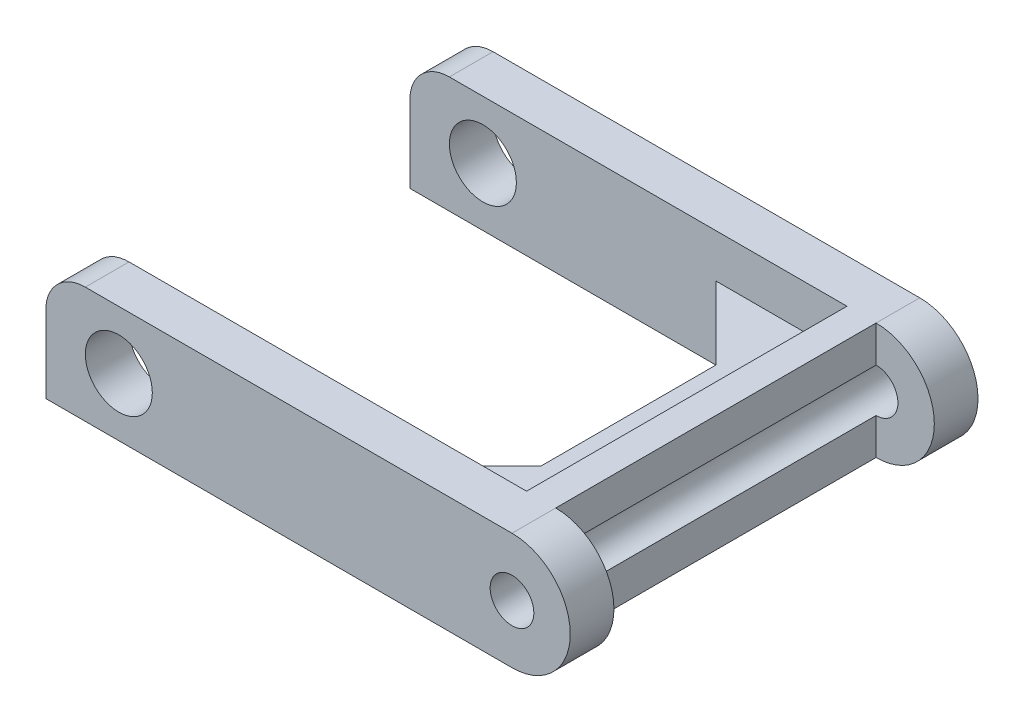
ISO-10303-21;
HEADER;
FILE_DESCRIPTION(('STEP AP214'),'2;1');
FILE_NAME('part.step','',(''),(''),'','','');
FILE_SCHEMA(('AUTOMOTIVE_DESIGN { 1 0 10303 214 1 1 1 1 }'));
ENDSEC;
DATA;
#1=APPLICATION_CONTEXT('core data for automotive mechanical design processes');
#2=APPLICATION_PROTOCOL_DEFINITION('international standard','automotive_design',2000,#1);
#3=PRODUCT_CONTEXT('',#1,'mechanical');
#4=PRODUCT('Part','Part','',(#3));
#5=PRODUCT_RELATED_PRODUCT_CATEGORY('part','',(#4));
#6=PRODUCT_DEFINITION_FORMATION('','',#4);
#7=PRODUCT_DEFINITION_CONTEXT('part definition',#1,'design');
#8=PRODUCT_DEFINITION('design','',#6,#7);
#9=PRODUCT_DEFINITION_SHAPE('','',#8);
#10=(LENGTH_UNIT() NAMED_UNIT(*) SI_UNIT(.MILLI.,.METRE.));
#11=(NAMED_UNIT(*) PLANE_ANGLE_UNIT() SI_UNIT($,.RADIAN.));
#12=(NAMED_UNIT(*) SI_UNIT($,.STERADIAN.) SOLID_ANGLE_UNIT());
#13=UNCERTAINTY_MEASURE_WITH_UNIT(LENGTH_MEASURE(1.E-05),#10,'distance_accuracy_value','');
#14=(GEOMETRIC_REPRESENTATION_CONTEXT(3) GLOBAL_UNCERTAINTY_ASSIGNED_CONTEXT((#13)) GLOBAL_UNIT_ASSIGNED_CONTEXT((#10,
#11,#12)) REPRESENTATION_CONTEXT('',''));
#15=CARTESIAN_POINT('',(0.,0.,0.));
#16=DIRECTION('',(0.,0.,1.));
#17=DIRECTION('',(1.,0.,0.));
#18=AXIS2_PLACEMENT_3D('',#15,#16,#17);
#19=CARTESIAN_POINT('',(-1.00000016391277,-19.4603503456678,-1.50000024586916));
#20=DIRECTION('',(-1.,0.,0.));
#21=DIRECTION('',(0.,0.,1.));
#22=AXIS2_PLACEMENT_3D('',#19,#20,#21);
#23=PLANE('',#22);
#24=DIRECTION('',(0.,1.,0.));
#25=VECTOR('',#24,1.);
#26=CARTESIAN_POINT('',(-1.00000016391277,-19.4603503456678,-12.5000001862645));
#27=LINE('',#26,#25);
#28=CARTESIAN_POINT('',(-1.00000016391277,0.500000071246183,-12.5000001862645));
#29=VERTEX_POINT('',#28);
#30=CARTESIAN_POINT('',(-1.00000016391277,1.99948681582866,-12.5000001862645));
#31=VERTEX_POINT('',#30);
#32=EDGE_CURVE('E298',#29,#31,#27,.T.);
#33=ORIENTED_EDGE('',*,*,#32,.F.);
#34=DIRECTION('',(0.,0.,-1.));
#35=VECTOR('',#34,1.);
#36=CARTESIAN_POINT('',(-1.00000016391277,0.500000071246183,-1.50000024586916));
#37=LINE('',#36,#35);
#38=CARTESIAN_POINT('',(-1.00000016391277,0.500000071246183,-1.50000024586916));
#39=VERTEX_POINT('',#38);
#40=EDGE_CURVE('E330',#39,#29,#37,.T.);
#41=ORIENTED_EDGE('',*,*,#40,.F.);
#42=DIRECTION('',(0.,1.,0.));
#43=VECTOR('',#42,1.);
#44=CARTESIAN_POINT('',(-1.00000016391277,-19.4603503456678,-1.50000024586916));
#45=LINE('',#44,#43);
#46=CARTESIAN_POINT('',(-1.00000016391277,1.99948681582866,-1.50000024586916));
#47=VERTEX_POINT('',#46);
#48=EDGE_CURVE('E294',#39,#47,#45,.T.);
#49=ORIENTED_EDGE('',*,*,#48,.T.);
#50=DIRECTION('',(0.,0.,1.));
#51=VECTOR('',#50,1.);
#52=CARTESIAN_POINT('',(-1.00000016391277,1.99948681582866,-14.0000004321337));
#53=LINE('',#52,#51);
#54=EDGE_CURVE('E235',#31,#47,#53,.T.);
#55=ORIENTED_EDGE('',*,*,#54,.F.);
#56=EDGE_LOOP('',(#33,#41,#49,#55));
#57=FACE_BOUND('',#56,.T.);
#58=ADVANCED_FACE('F43',(#57),#23,.T.);
#59=CARTESIAN_POINT('',(-14.6493035395222,0.635050337685843,-14.0000004321337));
#60=DIRECTION('',(0.,0.,1.));
#61=DIRECTION('',(1.,0.,0.));
#62=AXIS2_PLACEMENT_3D('',#59,#60,#61);
#63=CYLINDRICAL_SURFACE('',#62,1.35743104424977);
#64=DIRECTION('',(0.,0.,1.));
#65=VECTOR('',#64,1.);
#66=CARTESIAN_POINT('',(-15.9999998286366,0.770100604125558,-14.0000004321337));
#67=LINE('',#66,#65);
#68=CARTESIAN_POINT('',(-15.9999998286366,0.770100604125558,-14.0000004321337));
#69=VERTEX_POINT('',#68);
#70=CARTESIAN_POINT('',(-15.9999998286366,0.770100604125558,-12.5000001862645));
#71=VERTEX_POINT('',#70);
#72=EDGE_CURVE('E233',#69,#71,#67,.T.);
#73=ORIENTED_EDGE('',*,*,#72,.T.);
#74=CARTESIAN_POINT('',(-14.6493035395222,0.635050337685843,-12.5000001862645));
#75=DIRECTION('',(0.,0.,1.));
#76=DIRECTION('',(1.,0.,0.));
#77=AXIS2_PLACEMENT_3D('',#74,#75,#76);
#78=CIRCLE('',#77,1.35743104424977);
#79=CARTESIAN_POINT('',(-14.6500002160669,1.99248120315739,-12.5000001862645));
#80=VERTEX_POINT('',#79);
#81=EDGE_CURVE('E159',#71,#80,#78,.F.);
#82=ORIENTED_EDGE('',*,*,#81,.T.);
#83=DIRECTION('',(0.,0.,1.));
#84=VECTOR('',#83,1.);
#85=CARTESIAN_POINT('',(-14.6500002160669,1.99248120315739,-14.0000004321337));
#86=LINE('',#85,#84);
#87=CARTESIAN_POINT('',(-14.6500002160669,1.99248120315739,-14.0000004321337));
#88=VERTEX_POINT('',#87);
#89=EDGE_CURVE('E156',#88,#80,#86,.T.);
#90=ORIENTED_EDGE('',*,*,#89,.F.);
#91=CARTESIAN_POINT('',(-14.6493035395222,0.635050337685843,-14.0000004321337));
#92=DIRECTION('',(0.,0.,1.));
#93=DIRECTION('',(1.,0.,0.));
#94=AXIS2_PLACEMENT_3D('',#91,#92,#93);
#95=CIRCLE('',#94,1.35743104424977);
#96=EDGE_CURVE('E158',#88,#69,#95,.T.);
#97=ORIENTED_EDGE('',*,*,#96,.T.);
#98=EDGE_LOOP('',(#73,#82,#90,#97));
#99=FACE_BOUND('',#98,.T.);
#100=ADVANCED_FACE('F45',(#99),#63,.T.);
#101=CARTESIAN_POINT('',(-14.6493035395222,0.635050337685843,-1.50000024586917));
#102=DIRECTION('',(0.,0.,-1.));
#103=DIRECTION('',(-1.,0.,0.));
#104=AXIS2_PLACEMENT_3D('',#101,#102,#103);
#105=CIRCLE('',#104,1.35743104424977);
#106=CARTESIAN_POINT('',(-14.6500002160669,1.99248120315739,-1.50000024586917));
#107=VERTEX_POINT('',#106);
#108=CARTESIAN_POINT('',(-15.9999998286366,0.770100604125558,-1.50000024586917));
#109=VERTEX_POINT('',#108);
#110=EDGE_CURVE('E208',#107,#109,#105,.F.);
#111=ORIENTED_EDGE('',*,*,#110,.T.);
#112=DIRECTION('',(0.,0.,1.));
#113=VECTOR('',#112,1.);
#114=CARTESIAN_POINT('',(-15.9999998286366,0.770100604125558,-14.0000004321337));
#115=LINE('',#114,#113);
#116=CARTESIAN_POINT('',(-15.9999998286366,0.770100604125558,0.));
#117=VERTEX_POINT('',#116);
#118=EDGE_CURVE('E236',#109,#117,#115,.T.);
#119=ORIENTED_EDGE('',*,*,#118,.T.);
#120=CARTESIAN_POINT('',(-14.6493035395222,0.635050337685843,0.));
#121=DIRECTION('',(0.,0.,1.));
#122=DIRECTION('',(1.,0.,0.));
#123=AXIS2_PLACEMENT_3D('',#120,#121,#122);
#124=CIRCLE('',#123,1.35743104424977);
#125=CARTESIAN_POINT('',(-14.6500002160669,1.99248120315739,0.));
#126=VERTEX_POINT('',#125);
#127=EDGE_CURVE('E212',#126,#117,#124,.T.);
#128=ORIENTED_EDGE('',*,*,#127,.F.);
#129=EDGE_CURVE('E164',#107,#126,#86,.T.);
#130=ORIENTED_EDGE('',*,*,#129,.F.);
#131=EDGE_LOOP('',(#111,#119,#128,#130));
#132=FACE_BOUND('',#131,.T.);
#133=ADVANCED_FACE('F338',(#132),#63,.T.);
#134=CARTESIAN_POINT('',(-14.6500002160669,1.99248120315739,-14.0000004321337));
#135=DIRECTION('',(-0.000513231627973449,0.999999868296639,0.));
#136=DIRECTION('',(-0.999999868296639,-0.000513231627973449,0.));
#137=AXIS2_PLACEMENT_3D('',#134,#135,#136);
#138=PLANE('',#137);
#139=ORIENTED_EDGE('',*,*,#89,.T.);
#140=DIRECTION('',(0.999999868296639,0.000513231627973449,0.));
#141=VECTOR('',#140,1.);
#142=CARTESIAN_POINT('',(-14.6500002160669,1.99248120315739,-12.5000001862645));
#143=LINE('',#142,#141);
#144=EDGE_CURVE('E314',#80,#31,#143,.T.);
#145=ORIENTED_EDGE('',*,*,#144,.T.);
#146=ORIENTED_EDGE('',*,*,#54,.T.);
#147=DIRECTION('',(-0.999999868296639,-0.000513231627973449,0.));
#148=VECTOR('',#147,1.);
#149=CARTESIAN_POINT('',(-14.6500002160669,1.99248120315739,-1.50000024586917));
#150=LINE('',#149,#148);
#151=EDGE_CURVE('E307',#47,#107,#150,.T.);
#152=ORIENTED_EDGE('',*,*,#151,.T.);
#153=ORIENTED_EDGE('',*,*,#129,.T.);
#154=DIRECTION('',(-0.999999868296639,-0.000513231627973449,0.));
#155=VECTOR('',#154,1.);
#156=CARTESIAN_POINT('',(-14.6500002160669,1.99248120315739,0.));
#157=LINE('',#156,#155);
#158=CARTESIAN_POINT('',(-2.1606684497133E-07,2.00000004749746,0.));
#159=VERTEX_POINT('',#158);
#160=EDGE_CURVE('E170',#159,#126,#157,.T.);
#161=ORIENTED_EDGE('',*,*,#160,.F.);
#162=DIRECTION('',(0.,0.,1.));
#163=VECTOR('',#162,1.);
#164=CARTESIAN_POINT('',(-2.1606684497133E-07,2.00000004749746,-14.0000004321337));
#165=LINE('',#164,#163);
#166=CARTESIAN_POINT('',(0.,2.00000004749746,-1.50000024586916));
#167=VERTEX_POINT('',#166);
#168=EDGE_CURVE('E187',#167,#159,#165,.T.);
#169=ORIENTED_EDGE('',*,*,#168,.F.);
#170=DIRECTION('',(0.,0.,1.));
#171=VECTOR('',#170,1.);
#172=CARTESIAN_POINT('',(0.,2.00000004749746,-14.0000004321337));
#173=LINE('',#172,#171);
#174=CARTESIAN_POINT('',(0.,2.00000004749746,-12.5000001862645));
#175=VERTEX_POINT('',#174);
#176=EDGE_CURVE('E302',#167,#175,#173,.F.);
#177=ORIENTED_EDGE('',*,*,#176,.T.);
#178=CARTESIAN_POINT('',(-2.1606684497133E-07,2.00000004749746,-14.0000004321337));
#179=VERTEX_POINT('',#178);
#180=EDGE_CURVE('E176',#179,#175,#165,.T.);
#181=ORIENTED_EDGE('',*,*,#180,.F.);
#182=DIRECTION('',(-0.999999868296639,-0.000513231627973449,0.));
#183=VECTOR('',#182,1.);
#184=CARTESIAN_POINT('',(-14.6500002160669,1.99248120315739,-14.0000004321337));
#185=LINE('',#184,#183);
#186=EDGE_CURVE('E169',#179,#88,#185,.T.);
#187=ORIENTED_EDGE('',*,*,#186,.T.);
#188=EDGE_LOOP('',(#139,#145,#146,#152,#153,#161,#169,#177,#181,#187));
#189=FACE_BOUND('',#188,.T.);
#190=ADVANCED_FACE('F173',(#189),#138,.T.);
#191=CARTESIAN_POINT('',(0.,0.,-14.0000004321337));
#192=DIRECTION('',(0.,0.,1.));
#193=DIRECTION('',(1.,0.,0.));
#194=AXIS2_PLACEMENT_3D('',#191,#192,#193);
#195=CYLINDRICAL_SURFACE('',#194,2.00000004749746);
#196=CARTESIAN_POINT('',(0.,0.,-14.0000004321337));
#197=DIRECTION('',(0.,0.,1.));
#198=DIRECTION('',(1.,0.,0.));
#199=AXIS2_PLACEMENT_3D('',#196,#197,#198);
#200=CIRCLE('',#199,2.00000004749746);
#201=CARTESIAN_POINT('',(0.,-2.00000004749746,-14.0000004321337));
#202=VERTEX_POINT('',#201);
#203=EDGE_CURVE('E178',#202,#179,#200,.T.);
#204=ORIENTED_EDGE('',*,*,#203,.T.);
#205=ORIENTED_EDGE('',*,*,#180,.T.);
#206=CARTESIAN_POINT('',(0.,0.,-12.5000001862645));
#207=DIRECTION('',(0.,0.,1.));
#208=DIRECTION('',(1.,0.,0.));
#209=AXIS2_PLACEMENT_3D('',#206,#207,#208);
#210=CIRCLE('',#209,2.00000004749746);
#211=CARTESIAN_POINT('',(0.,-2.00000004749745,-12.5000001862645));
#212=VERTEX_POINT('',#211);
#213=EDGE_CURVE('E98',#175,#212,#210,.F.);
#214=ORIENTED_EDGE('',*,*,#213,.T.);
#215=DIRECTION('',(0.,0.,1.));
#216=VECTOR('',#215,1.);
#217=CARTESIAN_POINT('',(0.,-2.00000004749746,-14.0000004321337));
#218=LINE('',#217,#216);
#219=EDGE_CURVE('E188',#202,#212,#218,.T.);
#220=ORIENTED_EDGE('',*,*,#219,.F.);
#221=EDGE_LOOP('',(#204,#205,#214,#220));
#222=FACE_BOUND('',#221,.T.);
#223=ADVANCED_FACE('F358',(#222),#195,.T.);
#224=ORIENTED_EDGE('',*,*,#168,.T.);
#225=CARTESIAN_POINT('',(0.,0.,0.));
#226=DIRECTION('',(0.,0.,1.));
#227=DIRECTION('',(1.,0.,0.));
#228=AXIS2_PLACEMENT_3D('',#225,#226,#227);
#229=CIRCLE('',#228,2.00000004749746);
#230=CARTESIAN_POINT('',(0.,-2.00000004749746,0.));
#231=VERTEX_POINT('',#230);
#232=EDGE_CURVE('E216',#231,#159,#229,.T.);
#233=ORIENTED_EDGE('',*,*,#232,.F.);
#234=CARTESIAN_POINT('',(0.,-2.00000004749746,-1.50000024586916));
#235=VERTEX_POINT('',#234);
#236=EDGE_CURVE('E190',#235,#231,#218,.T.);
#237=ORIENTED_EDGE('',*,*,#236,.F.);
#238=CARTESIAN_POINT('',(0.,0.,-1.50000024586916));
#239=DIRECTION('',(0.,0.,-1.));
#240=DIRECTION('',(-1.,0.,0.));
#241=AXIS2_PLACEMENT_3D('',#238,#239,#240);
#242=CIRCLE('',#241,2.00000004749746);
#243=EDGE_CURVE('E282',#235,#167,#242,.F.);
#244=ORIENTED_EDGE('',*,*,#243,.T.);
#245=EDGE_LOOP('',(#224,#233,#237,#244));
#246=FACE_BOUND('',#245,.T.);
#247=ADVANCED_FACE('F347',(#246),#195,.T.);
#248=CARTESIAN_POINT('',(-15.9999998286366,-2.00000004749745,-14.0000004321337));
#249=DIRECTION('',(0.,-1.,0.));
#250=DIRECTION('',(0.,0.,-1.));
#251=AXIS2_PLACEMENT_3D('',#248,#249,#250);
#252=PLANE('',#251);
#253=DIRECTION('',(0.,0.,-1.));
#254=VECTOR('',#253,1.);
#255=CARTESIAN_POINT('',(-1.00000016391277,-2.00000004749745,-14.0000004321337));
#256=LINE('',#255,#254);
#257=CARTESIAN_POINT('',(-1.00000016391277,-2.00000004749745,-1.50000024586916));
#258=VERTEX_POINT('',#257);
#259=CARTESIAN_POINT('',(-1.00000016391277,-2.00000004749745,-12.5000001862645));
#260=VERTEX_POINT('',#259);
#261=EDGE_CURVE('E12',#258,#260,#256,.T.);
#262=ORIENTED_EDGE('',*,*,#261,.T.);
#263=DIRECTION('',(-1.,0.,0.));
#264=VECTOR('',#263,1.);
#265=CARTESIAN_POINT('',(-15.9999998286366,-2.00000004749745,-12.5000001862645));
#266=LINE('',#265,#264);
#267=CARTESIAN_POINT('',(-15.9999998286366,-2.00000004749745,-12.5000001862645));
#268=VERTEX_POINT('',#267);
#269=EDGE_CURVE('E207',#260,#268,#266,.T.);
#270=ORIENTED_EDGE('',*,*,#269,.T.);
#271=DIRECTION('',(0.,0.,1.));
#272=VECTOR('',#271,1.);
#273=CARTESIAN_POINT('',(-15.9999998286366,-2.00000004749745,-14.0000004321337));
#274=LINE('',#273,#272);
#275=CARTESIAN_POINT('',(-15.9999998286366,-2.00000004749745,-14.0000004321337));
#276=VERTEX_POINT('',#275);
#277=EDGE_CURVE('E180',#276,#268,#274,.T.);
#278=ORIENTED_EDGE('',*,*,#277,.F.);
#279=DIRECTION('',(1.,0.,0.));
#280=VECTOR('',#279,1.);
#281=CARTESIAN_POINT('',(-15.9999998286366,-2.00000004749745,-14.0000004321337));
#282=LINE('',#281,#280);
#283=EDGE_CURVE('E182',#276,#202,#282,.T.);
#284=ORIENTED_EDGE('',*,*,#283,.T.);
#285=ORIENTED_EDGE('',*,*,#219,.T.);
#286=DIRECTION('',(0.,0.,1.));
#287=VECTOR('',#286,1.);
#288=CARTESIAN_POINT('',(0.,-2.00000004749745,-14.0000004321337));
#289=LINE('',#288,#287);
#290=EDGE_CURVE('E280',#212,#235,#289,.T.);
#291=ORIENTED_EDGE('',*,*,#290,.T.);
#292=ORIENTED_EDGE('',*,*,#236,.T.);
#293=DIRECTION('',(1.,0.,0.));
#294=VECTOR('',#293,1.);
#295=CARTESIAN_POINT('',(-15.9999998286366,-2.00000004749745,0.));
#296=LINE('',#295,#294);
#297=CARTESIAN_POINT('',(-15.9999998286366,-2.00000004749745,0.));
#298=VERTEX_POINT('',#297);
#299=EDGE_CURVE('E211',#298,#231,#296,.T.);
#300=ORIENTED_EDGE('',*,*,#299,.F.);
#301=CARTESIAN_POINT('',(-15.9999998286366,-2.00000004749745,-1.50000024586917));
#302=VERTEX_POINT('',#301);
#303=EDGE_CURVE('E177',#302,#298,#274,.T.);
#304=ORIENTED_EDGE('',*,*,#303,.F.);
#305=DIRECTION('',(1.,0.,0.));
#306=VECTOR('',#305,1.);
#307=CARTESIAN_POINT('',(-15.9999998286367,-2.00000004749745,-1.50000024586917));
#308=LINE('',#307,#306);
#309=EDGE_CURVE('E204',#302,#258,#308,.T.);
#310=ORIENTED_EDGE('',*,*,#309,.T.);
#311=EDGE_LOOP('',(#262,#270,#278,#284,#285,#291,#292,#300,#304,#310));
#312=FACE_BOUND('',#311,.T.);
#313=ADVANCED_FACE('F359',(#312),#252,.T.);
#314=CARTESIAN_POINT('',(-15.9999998286366,0.500000071246183,-14.0000004321337));
#315=DIRECTION('',(-1.,0.,0.));
#316=DIRECTION('',(0.,0.,1.));
#317=AXIS2_PLACEMENT_3D('',#314,#315,#316);
#318=PLANE('',#317);
#319=ORIENTED_EDGE('',*,*,#277,.T.);
#320=DIRECTION('',(0.,1.,0.));
#321=VECTOR('',#320,1.);
#322=CARTESIAN_POINT('',(-15.9999998286366,-19.4603503456678,-12.5000001862645));
#323=LINE('',#322,#321);
#324=EDGE_CURVE('E234',#268,#71,#323,.T.);
#325=ORIENTED_EDGE('',*,*,#324,.T.);
#326=ORIENTED_EDGE('',*,*,#72,.F.);
#327=DIRECTION('',(0.,-1.,0.));
#328=VECTOR('',#327,1.);
#329=CARTESIAN_POINT('',(-15.9999998286366,0.500000071246183,-14.0000004321337));
#330=LINE('',#329,#328);
#331=EDGE_CURVE('E47',#69,#276,#330,.T.);
#332=ORIENTED_EDGE('',*,*,#331,.T.);
#333=EDGE_LOOP('',(#319,#325,#326,#332));
#334=FACE_BOUND('',#333,.T.);
#335=ADVANCED_FACE('F231',(#334),#318,.T.);
#336=DIRECTION('',(0.,-1.,0.));
#337=VECTOR('',#336,1.);
#338=CARTESIAN_POINT('',(-15.9999998286366,0.500000071246183,0.));
#339=LINE('',#338,#337);
#340=EDGE_CURVE('E209',#117,#298,#339,.T.);
#341=ORIENTED_EDGE('',*,*,#340,.F.);
#342=ORIENTED_EDGE('',*,*,#118,.F.);
#343=DIRECTION('',(0.,1.,0.));
#344=VECTOR('',#343,1.);
#345=CARTESIAN_POINT('',(-15.9999998286366,-19.4603503456678,-1.50000024586917));
#346=LINE('',#345,#344);
#347=EDGE_CURVE('E289',#302,#109,#346,.T.);
#348=ORIENTED_EDGE('',*,*,#347,.F.);
#349=ORIENTED_EDGE('',*,*,#303,.T.);
#350=EDGE_LOOP('',(#341,#342,#348,#349));
#351=FACE_BOUND('',#350,.T.);
#352=ADVANCED_FACE('F364',(#351),#318,.T.);
#353=CARTESIAN_POINT('',(-14.6493035395222,0.635050337685843,-14.0000004321337));
#354=DIRECTION('',(0.,0.,1.));
#355=DIRECTION('',(1.,0.,0.));
#356=AXIS2_PLACEMENT_3D('',#353,#354,#355);
#357=PLANE('',#356);
#358=CARTESIAN_POINT('',(-13.5000002160668,4.74974573561049E-08,-14.0000004321337));
#359=DIRECTION('',(0.,0.,1.));
#360=DIRECTION('',(1.,0.,0.));
#361=AXIS2_PLACEMENT_3D('',#358,#359,#360);
#362=CIRCLE('',#361,1.15);
#363=CARTESIAN_POINT('',(-12.3500002160668,4.74974573561049E-08,-14.0000004321337));
#364=VERTEX_POINT('',#363);
#365=EDGE_CURVE('E218',#364,#364,#362,.T.);
#366=ORIENTED_EDGE('',*,*,#365,.T.);
#367=EDGE_LOOP('',(#366));
#368=FACE_BOUND('',#367,.T.);
#369=CARTESIAN_POINT('',(0.,0.,-14.0000004321337));
#370=DIRECTION('',(0.,0.,1.));
#371=DIRECTION('',(1.,0.,0.));
#372=AXIS2_PLACEMENT_3D('',#369,#370,#371);
#373=CIRCLE('',#372,0.749999783933157);
#374=CARTESIAN_POINT('',(0.749999783933157,0.,-14.0000004321337));
#375=VERTEX_POINT('',#374);
#376=EDGE_CURVE('E247',#375,#375,#373,.T.);
#377=ORIENTED_EDGE('',*,*,#376,.T.);
#378=EDGE_LOOP('',(#377));
#379=FACE_BOUND('',#378,.T.);
#380=ORIENTED_EDGE('',*,*,#331,.F.);
#381=ORIENTED_EDGE('',*,*,#96,.F.);
#382=ORIENTED_EDGE('',*,*,#186,.F.);
#383=ORIENTED_EDGE('',*,*,#203,.F.);
#384=ORIENTED_EDGE('',*,*,#283,.F.);
#385=EDGE_LOOP('',(#380,#381,#382,#383,#384));
#386=FACE_BOUND('',#385,.T.);
#387=ADVANCED_FACE('F167',(#368,#379,#386),#357,.F.);
#388=CARTESIAN_POINT('',(-14.6493035395222,0.635050337685843,0.));
#389=DIRECTION('',(0.,0.,1.));
#390=DIRECTION('',(1.,0.,0.));
#391=AXIS2_PLACEMENT_3D('',#388,#389,#390);
#392=PLANE('',#391);
#393=CARTESIAN_POINT('',(-13.5000002160668,4.74974573561049E-08,0.));
#394=DIRECTION('',(0.,0.,1.));
#395=DIRECTION('',(1.,0.,0.));
#396=AXIS2_PLACEMENT_3D('',#393,#394,#395);
#397=CIRCLE('',#396,1.15);
#398=CARTESIAN_POINT('',(-12.3500002160668,4.74974573561049E-08,0.));
#399=VERTEX_POINT('',#398);
#400=EDGE_CURVE('E223',#399,#399,#397,.T.);
#401=ORIENTED_EDGE('',*,*,#400,.F.);
#402=EDGE_LOOP('',(#401));
#403=FACE_BOUND('',#402,.T.);
#404=CARTESIAN_POINT('',(0.,0.,0.));
#405=DIRECTION('',(0.,0.,1.));
#406=DIRECTION('',(1.,0.,0.));
#407=AXIS2_PLACEMENT_3D('',#404,#405,#406);
#408=CIRCLE('',#407,0.749999783933157);
#409=CARTESIAN_POINT('',(0.749999783933157,0.,0.));
#410=VERTEX_POINT('',#409);
#411=EDGE_CURVE('E239',#410,#410,#408,.T.);
#412=ORIENTED_EDGE('',*,*,#411,.F.);
#413=EDGE_LOOP('',(#412));
#414=FACE_BOUND('',#413,.T.);
#415=ORIENTED_EDGE('',*,*,#127,.T.);
#416=ORIENTED_EDGE('',*,*,#340,.T.);
#417=ORIENTED_EDGE('',*,*,#299,.T.);
#418=ORIENTED_EDGE('',*,*,#232,.T.);
#419=ORIENTED_EDGE('',*,*,#160,.T.);
#420=EDGE_LOOP('',(#415,#416,#417,#418,#419));
#421=FACE_BOUND('',#420,.T.);
#422=ADVANCED_FACE('F255',(#403,#414,#421),#392,.T.);
#423=CARTESIAN_POINT('',(-13.5000002160668,4.74974573561049E-08,-14.0000004321337));
#424=DIRECTION('',(0.,0.,1.));
#425=DIRECTION('',(1.,0.,0.));
#426=AXIS2_PLACEMENT_3D('',#423,#424,#425);
#427=CYLINDRICAL_SURFACE('',#426,1.15);
#428=ORIENTED_EDGE('',*,*,#365,.F.);
#429=EDGE_LOOP('',(#428));
#430=FACE_BOUND('',#429,.T.);
#431=CARTESIAN_POINT('',(-13.5000002160668,4.74974573561049E-08,-12.5000001862645));
#432=DIRECTION('',(0.,0.,1.));
#433=DIRECTION('',(1.,0.,0.));
#434=AXIS2_PLACEMENT_3D('',#431,#432,#433);
#435=CIRCLE('',#434,1.15);
#436=CARTESIAN_POINT('',(-12.3500002160668,4.74974573561049E-08,-12.5000001862645));
#437=VERTEX_POINT('',#436);
#438=EDGE_CURVE('E205',#437,#437,#435,.F.);
#439=ORIENTED_EDGE('',*,*,#438,.F.);
#440=EDGE_LOOP('',(#439));
#441=FACE_BOUND('',#440,.T.);
#442=ADVANCED_FACE('F258',(#430,#441),#427,.F.);
#443=ORIENTED_EDGE('',*,*,#400,.T.);
#444=EDGE_LOOP('',(#443));
#445=FACE_BOUND('',#444,.T.);
#446=CARTESIAN_POINT('',(-13.5000002160668,4.74974573561049E-08,-1.50000024586917));
#447=DIRECTION('',(0.,0.,-1.));
#448=DIRECTION('',(-1.,0.,0.));
#449=AXIS2_PLACEMENT_3D('',#446,#447,#448);
#450=CIRCLE('',#449,1.15);
#451=CARTESIAN_POINT('',(-14.6500002160668,4.74974573561049E-08,-1.50000024586917));
#452=VERTEX_POINT('',#451);
#453=EDGE_CURVE('E201',#452,#452,#450,.F.);
#454=ORIENTED_EDGE('',*,*,#453,.F.);
#455=EDGE_LOOP('',(#454));
#456=FACE_BOUND('',#455,.T.);
#457=ADVANCED_FACE('F252',(#445,#456),#427,.F.);
#458=CARTESIAN_POINT('',(0.,0.,-14.0000004321337));
#459=DIRECTION('',(0.,0.,1.));
#460=DIRECTION('',(1.,0.,0.));
#461=AXIS2_PLACEMENT_3D('',#458,#459,#460);
#462=CYLINDRICAL_SURFACE('',#461,0.749999783933157);
#463=ORIENTED_EDGE('',*,*,#411,.T.);
#464=EDGE_LOOP('',(#463));
#465=FACE_BOUND('',#464,.T.);
#466=ORIENTED_EDGE('',*,*,#376,.F.);
#467=EDGE_LOOP('',(#466));
#468=FACE_BOUND('',#467,.T.);
#469=CARTESIAN_POINT('',(0.,0.,-12.5000001862645));
#470=DIRECTION('',(0.,0.,1.));
#471=DIRECTION('',(1.,0.,0.));
#472=AXIS2_PLACEMENT_3D('',#469,#470,#471);
#473=CIRCLE('',#472,0.749999783933157);
#474=CARTESIAN_POINT('',(0.,0.749999783933156,-12.5000001862645));
#475=VERTEX_POINT('',#474);
#476=CARTESIAN_POINT('',(0.,-0.749999783933156,-12.5000001862645));
#477=VERTEX_POINT('',#476);
#478=EDGE_CURVE('E52',#475,#477,#473,.F.);
#479=ORIENTED_EDGE('',*,*,#478,.F.);
#480=DIRECTION('',(0.,0.,1.));
#481=VECTOR('',#480,1.);
#482=CARTESIAN_POINT('',(0.,0.749999783933157,-14.0000004321337));
#483=LINE('',#482,#481);
#484=CARTESIAN_POINT('',(0.,0.749999783933157,-1.50000024586916));
#485=VERTEX_POINT('',#484);
#486=EDGE_CURVE('E197',#485,#475,#483,.F.);
#487=ORIENTED_EDGE('',*,*,#486,.F.);
#488=CARTESIAN_POINT('',(0.,0.,-1.50000024586916));
#489=DIRECTION('',(0.,0.,-1.));
#490=DIRECTION('',(-1.,0.,0.));
#491=AXIS2_PLACEMENT_3D('',#488,#489,#490);
#492=CIRCLE('',#491,0.749999783933157);
#493=CARTESIAN_POINT('',(0.,-0.749999783933157,-1.50000024586916));
#494=VERTEX_POINT('',#493);
#495=EDGE_CURVE('E163',#494,#485,#492,.F.);
#496=ORIENTED_EDGE('',*,*,#495,.F.);
#497=DIRECTION('',(0.,0.,1.));
#498=VECTOR('',#497,1.);
#499=CARTESIAN_POINT('',(0.,-0.749999783933157,-14.0000004321337));
#500=LINE('',#499,#498);
#501=EDGE_CURVE('E195',#477,#494,#500,.T.);
#502=ORIENTED_EDGE('',*,*,#501,.F.);
#503=EDGE_LOOP('',(#479,#487,#496,#502));
#504=FACE_BOUND('',#503,.T.);
#505=ADVANCED_FACE('F262',(#465,#468,#504),#462,.F.);
#506=CARTESIAN_POINT('',(0.,-19.4603503456678,-1.50000024586916));
#507=DIRECTION('',(0.,0.,-1.));
#508=DIRECTION('',(-1.,0.,0.));
#509=AXIS2_PLACEMENT_3D('',#506,#507,#508);
#510=PLANE('',#509);
#511=DIRECTION('',(0.,1.,0.));
#512=VECTOR('',#511,1.);
#513=CARTESIAN_POINT('',(0.,-19.4603503456678,-1.50000024586916));
#514=LINE('',#513,#512);
#515=EDGE_CURVE('E69',#235,#494,#514,.T.);
#516=ORIENTED_EDGE('',*,*,#515,.T.);
#517=ORIENTED_EDGE('',*,*,#495,.T.);
#518=EDGE_CURVE('E286',#485,#167,#514,.T.);
#519=ORIENTED_EDGE('',*,*,#518,.T.);
#520=ORIENTED_EDGE('',*,*,#243,.F.);
#521=EDGE_LOOP('',(#516,#517,#519,#520));
#522=FACE_BOUND('',#521,.T.);
#523=ADVANCED_FACE('F265',(#522),#510,.T.);
#524=CARTESIAN_POINT('',(0.,-19.4603503456678,-12.5000001862645));
#525=DIRECTION('',(1.,0.,0.));
#526=DIRECTION('',(0.,0.,-1.));
#527=AXIS2_PLACEMENT_3D('',#524,#525,#526);
#528=PLANE('',#527);
#529=DIRECTION('',(0.,1.,0.));
#530=VECTOR('',#529,1.);
#531=CARTESIAN_POINT('',(0.,-19.4603503456678,-12.5000001862645));
#532=LINE('',#531,#530);
#533=EDGE_CURVE('E276',#212,#477,#532,.T.);
#534=ORIENTED_EDGE('',*,*,#533,.T.);
#535=ORIENTED_EDGE('',*,*,#501,.T.);
#536=ORIENTED_EDGE('',*,*,#515,.F.);
#537=ORIENTED_EDGE('',*,*,#290,.F.);
#538=EDGE_LOOP('',(#534,#535,#536,#537));
#539=FACE_BOUND('',#538,.T.);
#540=ADVANCED_FACE('F278',(#539),#528,.T.);
#541=ORIENTED_EDGE('',*,*,#518,.F.);
#542=ORIENTED_EDGE('',*,*,#486,.T.);
#543=EDGE_CURVE('E277',#475,#175,#532,.T.);
#544=ORIENTED_EDGE('',*,*,#543,.T.);
#545=ORIENTED_EDGE('',*,*,#176,.F.);
#546=EDGE_LOOP('',(#541,#542,#544,#545));
#547=FACE_BOUND('',#546,.T.);
#548=ADVANCED_FACE('F352',(#547),#528,.T.);
#549=CARTESIAN_POINT('',(1.99999939650297,-19.4603503456678,-12.5000001862645));
#550=DIRECTION('',(0.,0.,1.));
#551=DIRECTION('',(1.,0.,0.));
#552=AXIS2_PLACEMENT_3D('',#549,#550,#551);
#553=PLANE('',#552);
#554=ORIENTED_EDGE('',*,*,#213,.F.);
#555=ORIENTED_EDGE('',*,*,#543,.F.);
#556=ORIENTED_EDGE('',*,*,#478,.T.);
#557=ORIENTED_EDGE('',*,*,#533,.F.);
#558=EDGE_LOOP('',(#554,#555,#556,#557));
#559=FACE_BOUND('',#558,.T.);
#560=ADVANCED_FACE('F274',(#559),#553,.T.);
#561=CARTESIAN_POINT('',(-5.50000020302832,-19.4603503456678,-12.5000001862645));
#562=DIRECTION('',(0.,0.,1.));
#563=DIRECTION('',(1.,0.,0.));
#564=AXIS2_PLACEMENT_3D('',#561,#562,#563);
#565=PLANE('',#564);
#566=DIRECTION('',(-1.,0.,0.));
#567=VECTOR('',#566,1.);
#568=CARTESIAN_POINT('',(-1.00000016391277,-0.499999976251268,-12.5000001862645));
#569=LINE('',#568,#567);
#570=CARTESIAN_POINT('',(-1.00000016391277,-0.499999976251268,-12.5000001862645));
#571=VERTEX_POINT('',#570);
#572=CARTESIAN_POINT('',(-5.50000020302832,-0.499999976251268,-12.5000001862645));
#573=VERTEX_POINT('',#572);
#574=EDGE_CURVE('E416',#571,#573,#569,.T.);
#575=ORIENTED_EDGE('',*,*,#574,.T.);
#576=DIRECTION('',(0.,1.,0.));
#577=VECTOR('',#576,1.);
#578=CARTESIAN_POINT('',(-5.50000020302832,-0.499999976251268,-12.5000001862645));
#579=LINE('',#578,#577);
#580=CARTESIAN_POINT('',(-5.50000020302832,0.500000071246183,-12.5000001862645));
#581=VERTEX_POINT('',#580);
#582=EDGE_CURVE('E407',#573,#581,#579,.T.);
#583=ORIENTED_EDGE('',*,*,#582,.T.);
#584=DIRECTION('',(-1.,0.,0.));
#585=VECTOR('',#584,1.);
#586=CARTESIAN_POINT('',(-1.00000016391277,0.500000071246183,-12.5000001862645));
#587=LINE('',#586,#585);
#588=EDGE_CURVE('E325',#29,#581,#587,.T.);
#589=ORIENTED_EDGE('',*,*,#588,.F.);
#590=ORIENTED_EDGE('',*,*,#32,.T.);
#591=ORIENTED_EDGE('',*,*,#144,.F.);
#592=ORIENTED_EDGE('',*,*,#81,.F.);
#593=ORIENTED_EDGE('',*,*,#324,.F.);
#594=ORIENTED_EDGE('',*,*,#269,.F.);
#595=EDGE_CURVE('E295',#260,#571,#27,.T.);
#596=ORIENTED_EDGE('',*,*,#595,.T.);
#597=EDGE_LOOP('',(#575,#583,#589,#590,#591,#592,#593,#594,#596));
#598=FACE_BOUND('',#597,.T.);
#599=ORIENTED_EDGE('',*,*,#438,.T.);
#600=EDGE_LOOP('',(#599));
#601=FACE_BOUND('',#600,.T.);
#602=ADVANCED_FACE('F318',(#598,#601),#565,.T.);
#603=CARTESIAN_POINT('',(-15.9999998286366,-19.4603503456678,-1.50000024586917));
#604=DIRECTION('',(0.,0.,-1.));
#605=DIRECTION('',(-1.,0.,0.));
#606=AXIS2_PLACEMENT_3D('',#603,#604,#605);
#607=PLANE('',#606);
#608=DIRECTION('',(1.,0.,0.));
#609=VECTOR('',#608,1.);
#610=CARTESIAN_POINT('',(-5.50000020302832,-0.499999976251268,-1.50000024586916));
#611=LINE('',#610,#609);
#612=CARTESIAN_POINT('',(-5.50000020302832,-0.499999976251268,-1.50000024586916));
#613=VERTEX_POINT('',#612);
#614=CARTESIAN_POINT('',(-1.00000016391277,-0.499999976251268,-1.50000024586916));
#615=VERTEX_POINT('',#614);
#616=EDGE_CURVE('E369',#613,#615,#611,.T.);
#617=ORIENTED_EDGE('',*,*,#616,.T.);
#618=EDGE_CURVE('E291',#258,#615,#45,.T.);
#619=ORIENTED_EDGE('',*,*,#618,.F.);
#620=ORIENTED_EDGE('',*,*,#309,.F.);
#621=ORIENTED_EDGE('',*,*,#347,.T.);
#622=ORIENTED_EDGE('',*,*,#110,.F.);
#623=ORIENTED_EDGE('',*,*,#151,.F.);
#624=ORIENTED_EDGE('',*,*,#48,.F.);
#625=DIRECTION('',(1.,0.,0.));
#626=VECTOR('',#625,1.);
#627=CARTESIAN_POINT('',(-5.50000020302832,0.500000071246183,-1.50000024586916));
#628=LINE('',#627,#626);
#629=CARTESIAN_POINT('',(-5.50000020302832,0.500000071246183,-1.50000024586916));
#630=VERTEX_POINT('',#629);
#631=EDGE_CURVE('E60',#630,#39,#628,.T.);
#632=ORIENTED_EDGE('',*,*,#631,.F.);
#633=DIRECTION('',(0.,1.,0.));
#634=VECTOR('',#633,1.);
#635=CARTESIAN_POINT('',(-5.50000020302832,-0.499999976251268,-1.50000024586916));
#636=LINE('',#635,#634);
#637=EDGE_CURVE('E327',#613,#630,#636,.T.);
#638=ORIENTED_EDGE('',*,*,#637,.F.);
#639=EDGE_LOOP('',(#617,#619,#620,#621,#622,#623,#624,#632,#638));
#640=FACE_BOUND('',#639,.T.);
#641=ORIENTED_EDGE('',*,*,#453,.T.);
#642=EDGE_LOOP('',(#641));
#643=FACE_BOUND('',#642,.T.);
#644=ADVANCED_FACE('F333',(#640,#643),#607,.T.);
#645=DIRECTION('',(0.,0.,-1.));
#646=VECTOR('',#645,1.);
#647=CARTESIAN_POINT('',(-1.00000016391277,-0.499999976251268,-1.50000024586916));
#648=LINE('',#647,#646);
#649=EDGE_CURVE('E375',#615,#571,#648,.T.);
#650=ORIENTED_EDGE('',*,*,#649,.T.);
#651=ORIENTED_EDGE('',*,*,#595,.F.);
#652=ORIENTED_EDGE('',*,*,#261,.F.);
#653=ORIENTED_EDGE('',*,*,#618,.T.);
#654=EDGE_LOOP('',(#650,#651,#652,#653));
#655=FACE_BOUND('',#654,.T.);
#656=ADVANCED_FACE('F372',(#655),#23,.T.);
#657=CARTESIAN_POINT('',(-5.50000020302832,-0.499999976251268,-1.50000024586916));
#658=DIRECTION('',(-0.707106748259322,0.,-0.707106814113771));
#659=DIRECTION('',(-0.707106814113772,0.,0.707106748259322));
#660=AXIS2_PLACEMENT_3D('',#657,#658,#659);
#661=PLANE('',#660);
#662=DIRECTION('',(-0.707106814113771,0.,0.707106748259322));
#663=VECTOR('',#662,1.);
#664=CARTESIAN_POINT('',(-5.50000020302832,0.500000071246183,-1.50000024586916));
#665=LINE('',#664,#663);
#666=CARTESIAN_POINT('',(-3.00000002607703,0.500000071246183,-4.00000018998981));
#667=VERTEX_POINT('',#666);
#668=EDGE_CURVE('E435',#667,#630,#665,.T.);
#669=ORIENTED_EDGE('',*,*,#668,.F.);
#670=DIRECTION('',(0.,1.,0.));
#671=VECTOR('',#670,1.);
#672=CARTESIAN_POINT('',(-3.00000002607703,-0.499999976251268,-4.00000018998981));
#673=LINE('',#672,#671);
#674=CARTESIAN_POINT('',(-3.00000002607703,-0.499999976251268,-4.00000018998981));
#675=VERTEX_POINT('',#674);
#676=EDGE_CURVE('E417',#675,#667,#673,.T.);
#677=ORIENTED_EDGE('',*,*,#676,.F.);
#678=DIRECTION('',(-0.707106814113771,0.,0.707106748259322));
#679=VECTOR('',#678,1.);
#680=CARTESIAN_POINT('',(-5.50000020302832,-0.499999976251268,-1.50000024586916));
#681=LINE('',#680,#679);
#682=EDGE_CURVE('E424',#675,#613,#681,.T.);
#683=ORIENTED_EDGE('',*,*,#682,.T.);
#684=ORIENTED_EDGE('',*,*,#637,.T.);
#685=EDGE_LOOP('',(#669,#677,#683,#684));
#686=FACE_BOUND('',#685,.T.);
#687=ADVANCED_FACE('F443',(#686),#661,.T.);
#688=CARTESIAN_POINT('',(-3.00000002607703,-0.499999976251268,-4.00000018998981));
#689=DIRECTION('',(-1.,0.,0.));
#690=DIRECTION('',(0.,0.,1.));
#691=AXIS2_PLACEMENT_3D('',#688,#689,#690);
#692=PLANE('',#691);
#693=DIRECTION('',(0.,0.,1.));
#694=VECTOR('',#693,1.);
#695=CARTESIAN_POINT('',(-3.00000002607703,0.500000071246183,-4.00000018998981));
#696=LINE('',#695,#694);
#697=CARTESIAN_POINT('',(-3.00000002607703,0.500000071246183,-10.0000002421439));
#698=VERTEX_POINT('',#697);
#699=EDGE_CURVE('E412',#698,#667,#696,.T.);
#700=ORIENTED_EDGE('',*,*,#699,.F.);
#701=DIRECTION('',(0.,1.,0.));
#702=VECTOR('',#701,1.);
#703=CARTESIAN_POINT('',(-3.00000002607703,-0.499999976251268,-10.0000002421439));
#704=LINE('',#703,#702);
#705=CARTESIAN_POINT('',(-3.00000002607703,-0.499999976251268,-10.0000002421439));
#706=VERTEX_POINT('',#705);
#707=EDGE_CURVE('E409',#706,#698,#704,.T.);
#708=ORIENTED_EDGE('',*,*,#707,.F.);
#709=DIRECTION('',(0.,0.,1.));
#710=VECTOR('',#709,1.);
#711=CARTESIAN_POINT('',(-3.00000002607703,-0.499999976251268,-4.00000018998981));
#712=LINE('',#711,#710);
#713=EDGE_CURVE('E427',#706,#675,#712,.T.);
#714=ORIENTED_EDGE('',*,*,#713,.T.);
#715=ORIENTED_EDGE('',*,*,#676,.T.);
#716=EDGE_LOOP('',(#700,#708,#714,#715));
#717=FACE_BOUND('',#716,.T.);
#718=ADVANCED_FACE('F439',(#717),#692,.T.);
#719=CARTESIAN_POINT('',(-3.00000002607703,-0.499999976251268,-10.0000002421439));
#720=DIRECTION('',(-0.707106748259322,0.,0.707106814113771));
#721=DIRECTION('',(0.707106814113772,0.,0.707106748259322));
#722=AXIS2_PLACEMENT_3D('',#719,#720,#721);
#723=PLANE('',#722);
#724=DIRECTION('',(0.707106814113771,0.,0.707106748259322));
#725=VECTOR('',#724,1.);
#726=CARTESIAN_POINT('',(-3.00000002607703,0.500000071246183,-10.0000002421439));
#727=LINE('',#726,#725);
#728=EDGE_CURVE('E404',#581,#698,#727,.T.);
#729=ORIENTED_EDGE('',*,*,#728,.F.);
#730=ORIENTED_EDGE('',*,*,#582,.F.);
#731=DIRECTION('',(0.707106814113771,0.,0.707106748259322));
#732=VECTOR('',#731,1.);
#733=CARTESIAN_POINT('',(-3.00000002607703,-0.499999976251268,-10.0000002421439));
#734=LINE('',#733,#732);
#735=EDGE_CURVE('E430',#573,#706,#734,.T.);
#736=ORIENTED_EDGE('',*,*,#735,.T.);
#737=ORIENTED_EDGE('',*,*,#707,.T.);
#738=EDGE_LOOP('',(#729,#730,#736,#737));
#739=FACE_BOUND('',#738,.T.);
#740=ADVANCED_FACE('F405',(#739),#723,.T.);
#741=CARTESIAN_POINT('',(-3.00000002607703,-0.499999976251268,-12.5000001862645));
#742=DIRECTION('',(0.,-1.,0.));
#743=DIRECTION('',(0.,0.,-1.));
#744=AXIS2_PLACEMENT_3D('',#741,#742,#743);
#745=PLANE('',#744);
#746=ORIENTED_EDGE('',*,*,#574,.F.);
#747=ORIENTED_EDGE('',*,*,#649,.F.);
#748=ORIENTED_EDGE('',*,*,#616,.F.);
#749=ORIENTED_EDGE('',*,*,#682,.F.);
#750=ORIENTED_EDGE('',*,*,#713,.F.);
#751=ORIENTED_EDGE('',*,*,#735,.F.);
#752=EDGE_LOOP('',(#746,#747,#748,#749,#750,#751));
#753=FACE_BOUND('',#752,.T.);
#754=ADVANCED_FACE('F444',(#753),#745,.T.);
#755=CARTESIAN_POINT('',(-3.00000002607703,0.500000071246183,-12.5000001862645));
#756=DIRECTION('',(0.,-1.,0.));
#757=DIRECTION('',(0.,0.,-1.));
#758=AXIS2_PLACEMENT_3D('',#755,#756,#757);
#759=PLANE('',#758);
#760=ORIENTED_EDGE('',*,*,#588,.T.);
#761=ORIENTED_EDGE('',*,*,#728,.T.);
#762=ORIENTED_EDGE('',*,*,#699,.T.);
#763=ORIENTED_EDGE('',*,*,#668,.T.);
#764=ORIENTED_EDGE('',*,*,#631,.T.);
#765=ORIENTED_EDGE('',*,*,#40,.T.);
#766=EDGE_LOOP('',(#760,#761,#762,#763,#764,#765));
#767=FACE_BOUND('',#766,.T.);
#768=ADVANCED_FACE('F414',(#767),#759,.F.);
#769=CLOSED_SHELL('',(#58,#100,#133,#190,#223,#247,#313,#335,#352,#387,#422,#442,#457,#505,#523,
#540,#548,#560,#602,#644,#656,#687,#718,#740,#754,#768));
#770=MANIFOLD_SOLID_BREP('B2',#769);
#771=ADVANCED_BREP_SHAPE_REPRESENTATION('',(#18,#770),#14);
#772=SHAPE_DEFINITION_REPRESENTATION(#9,#771);
ENDSEC;
END-ISO-10303-21;
